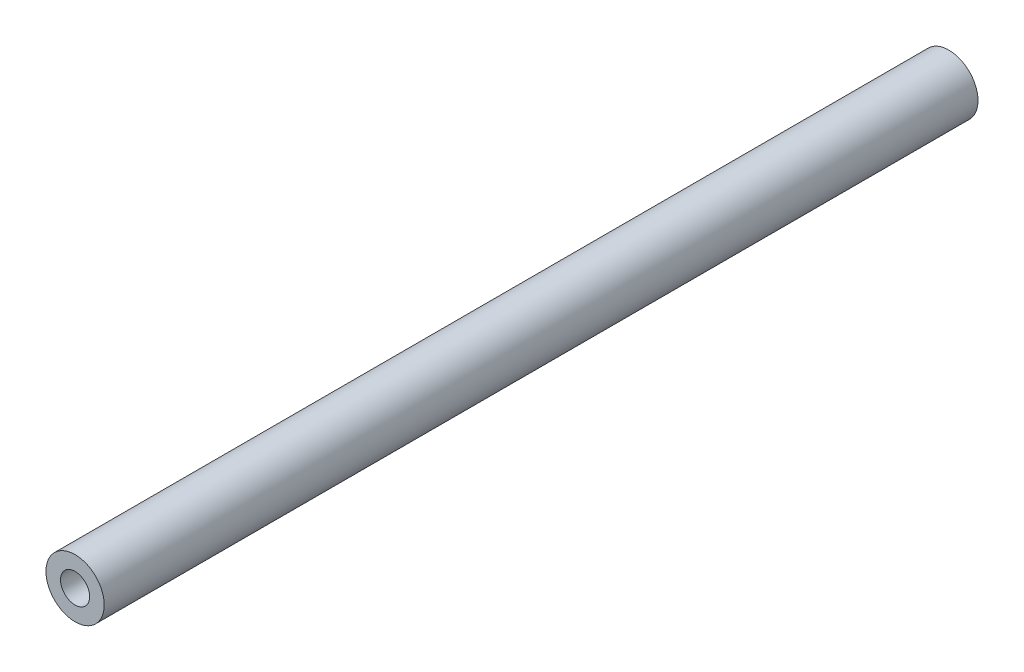
ISO-10303-21;
HEADER;
FILE_DESCRIPTION(('STEP AP214'),'2;1');
FILE_NAME('part.step','',(''),(''),'','','');
FILE_SCHEMA(('AUTOMOTIVE_DESIGN { 1 0 10303 214 1 1 1 1 }'));
ENDSEC;
DATA;
#1=APPLICATION_CONTEXT('core data for automotive mechanical design processes');
#2=APPLICATION_PROTOCOL_DEFINITION('international standard','automotive_design',2000,#1);
#3=PRODUCT_CONTEXT('',#1,'mechanical');
#4=PRODUCT('Part','Part','',(#3));
#5=PRODUCT_RELATED_PRODUCT_CATEGORY('part','',(#4));
#6=PRODUCT_DEFINITION_FORMATION('','',#4);
#7=PRODUCT_DEFINITION_CONTEXT('part definition',#1,'design');
#8=PRODUCT_DEFINITION('design','',#6,#7);
#9=PRODUCT_DEFINITION_SHAPE('','',#8);
#10=(LENGTH_UNIT() NAMED_UNIT(*) SI_UNIT(.MILLI.,.METRE.));
#11=(NAMED_UNIT(*) PLANE_ANGLE_UNIT() SI_UNIT($,.RADIAN.));
#12=(NAMED_UNIT(*) SI_UNIT($,.STERADIAN.) SOLID_ANGLE_UNIT());
#13=UNCERTAINTY_MEASURE_WITH_UNIT(LENGTH_MEASURE(1.E-05),#10,'distance_accuracy_value','');
#14=(GEOMETRIC_REPRESENTATION_CONTEXT(3) GLOBAL_UNCERTAINTY_ASSIGNED_CONTEXT((#13)) GLOBAL_UNIT_ASSIGNED_CONTEXT((#10,
#11,#12)) REPRESENTATION_CONTEXT('',''));
#15=CARTESIAN_POINT('',(0.,0.,0.));
#16=DIRECTION('',(0.,0.,1.));
#17=DIRECTION('',(1.,0.,0.));
#18=AXIS2_PLACEMENT_3D('',#15,#16,#17);
#19=CARTESIAN_POINT('',(0.,0.,60.));
#20=DIRECTION('',(0.,0.,1.));
#21=DIRECTION('',(1.,0.,0.));
#22=AXIS2_PLACEMENT_3D('',#19,#20,#21);
#23=PLANE('',#22);
#24=CARTESIAN_POINT('',(0.,0.,60.));
#25=DIRECTION('',(0.,0.,1.));
#26=DIRECTION('',(1.,0.,0.));
#27=AXIS2_PLACEMENT_3D('',#24,#25,#26);
#28=CIRCLE('',#27,2.);
#29=CARTESIAN_POINT('',(2.,0.,60.));
#30=VERTEX_POINT('',#29);
#31=EDGE_CURVE('E10',#30,#30,#28,.T.);
#32=ORIENTED_EDGE('',*,*,#31,.T.);
#33=EDGE_LOOP('',(#32));
#34=FACE_BOUND('',#33,.T.);
#35=CARTESIAN_POINT('',(0.,0.,60.));
#36=DIRECTION('',(0.,0.,1.));
#37=DIRECTION('',(1.,0.,0.));
#38=AXIS2_PLACEMENT_3D('',#35,#36,#37);
#39=CIRCLE('',#38,1.);
#40=CARTESIAN_POINT('',(1.,0.,60.));
#41=VERTEX_POINT('',#40);
#42=EDGE_CURVE('E42',#41,#41,#39,.T.);
#43=ORIENTED_EDGE('',*,*,#42,.F.);
#44=EDGE_LOOP('',(#43));
#45=FACE_BOUND('',#44,.T.);
#46=ADVANCED_FACE('F31',(#34,#45),#23,.T.);
#47=CARTESIAN_POINT('',(0.,0.,0.));
#48=DIRECTION('',(0.,0.,1.));
#49=DIRECTION('',(1.,0.,0.));
#50=AXIS2_PLACEMENT_3D('',#47,#48,#49);
#51=PLANE('',#50);
#52=CARTESIAN_POINT('',(0.,0.,0.));
#53=DIRECTION('',(0.,0.,1.));
#54=DIRECTION('',(1.,0.,0.));
#55=AXIS2_PLACEMENT_3D('',#52,#53,#54);
#56=CIRCLE('',#55,2.);
#57=CARTESIAN_POINT('',(2.,0.,0.));
#58=VERTEX_POINT('',#57);
#59=EDGE_CURVE('E35',#58,#58,#56,.T.);
#60=ORIENTED_EDGE('',*,*,#59,.F.);
#61=EDGE_LOOP('',(#60));
#62=FACE_BOUND('',#61,.T.);
#63=CARTESIAN_POINT('',(0.,0.,0.));
#64=DIRECTION('',(0.,0.,1.));
#65=DIRECTION('',(1.,0.,0.));
#66=AXIS2_PLACEMENT_3D('',#63,#64,#65);
#67=CIRCLE('',#66,1.);
#68=CARTESIAN_POINT('',(1.,0.,0.));
#69=VERTEX_POINT('',#68);
#70=EDGE_CURVE('E44',#69,#69,#67,.T.);
#71=ORIENTED_EDGE('',*,*,#70,.T.);
#72=EDGE_LOOP('',(#71));
#73=FACE_BOUND('',#72,.T.);
#74=ADVANCED_FACE('F54',(#62,#73),#51,.F.);
#75=CARTESIAN_POINT('',(0.,0.,60.));
#76=DIRECTION('',(0.,0.,-1.));
#77=DIRECTION('',(-1.,0.,0.));
#78=AXIS2_PLACEMENT_3D('',#75,#76,#77);
#79=CYLINDRICAL_SURFACE('',#78,2.);
#80=ORIENTED_EDGE('',*,*,#31,.F.);
#81=EDGE_LOOP('',(#80));
#82=FACE_BOUND('',#81,.T.);
#83=ORIENTED_EDGE('',*,*,#59,.T.);
#84=EDGE_LOOP('',(#83));
#85=FACE_BOUND('',#84,.T.);
#86=ADVANCED_FACE('F33',(#82,#85),#79,.T.);
#87=CARTESIAN_POINT('',(0.,0.,60.));
#88=DIRECTION('',(0.,0.,-1.));
#89=DIRECTION('',(-1.,0.,0.));
#90=AXIS2_PLACEMENT_3D('',#87,#88,#89);
#91=CYLINDRICAL_SURFACE('',#90,1.);
#92=ORIENTED_EDGE('',*,*,#42,.T.);
#93=EDGE_LOOP('',(#92));
#94=FACE_BOUND('',#93,.T.);
#95=ORIENTED_EDGE('',*,*,#70,.F.);
#96=EDGE_LOOP('',(#95));
#97=FACE_BOUND('',#96,.T.);
#98=ADVANCED_FACE('F50',(#94,#97),#91,.F.);
#99=CLOSED_SHELL('',(#46,#74,#86,#98));
#100=MANIFOLD_SOLID_BREP('B2',#99);
#101=ADVANCED_BREP_SHAPE_REPRESENTATION('',(#18,#100),#14);
#102=SHAPE_DEFINITION_REPRESENTATION(#9,#101);
ENDSEC;
END-ISO-10303-21;
